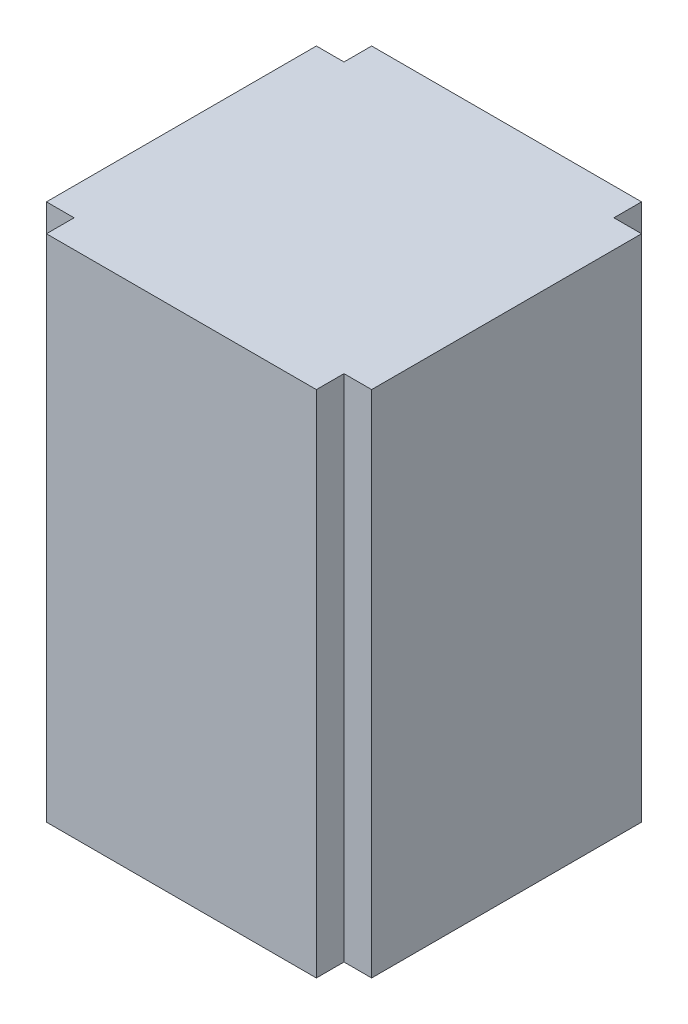
ISO-10303-21;
HEADER;
FILE_DESCRIPTION(('STEP AP214'),'2;1');
FILE_NAME('part.step','',(''),(''),'','','');
FILE_SCHEMA(('AUTOMOTIVE_DESIGN { 1 0 10303 214 1 1 1 1 }'));
ENDSEC;
DATA;
#1=APPLICATION_CONTEXT('core data for automotive mechanical design processes');
#2=APPLICATION_PROTOCOL_DEFINITION('international standard','automotive_design',2000,#1);
#3=PRODUCT_CONTEXT('',#1,'mechanical');
#4=PRODUCT('Part','Part','',(#3));
#5=PRODUCT_RELATED_PRODUCT_CATEGORY('part','',(#4));
#6=PRODUCT_DEFINITION_FORMATION('','',#4);
#7=PRODUCT_DEFINITION_CONTEXT('part definition',#1,'design');
#8=PRODUCT_DEFINITION('design','',#6,#7);
#9=PRODUCT_DEFINITION_SHAPE('','',#8);
#10=(LENGTH_UNIT() NAMED_UNIT(*) SI_UNIT(.MILLI.,.METRE.));
#11=(NAMED_UNIT(*) PLANE_ANGLE_UNIT() SI_UNIT($,.RADIAN.));
#12=(NAMED_UNIT(*) SI_UNIT($,.STERADIAN.) SOLID_ANGLE_UNIT());
#13=UNCERTAINTY_MEASURE_WITH_UNIT(LENGTH_MEASURE(1.E-05),#10,'distance_accuracy_value','');
#14=(GEOMETRIC_REPRESENTATION_CONTEXT(3) GLOBAL_UNCERTAINTY_ASSIGNED_CONTEXT((#13)) GLOBAL_UNIT_ASSIGNED_CONTEXT((#10,
#11,#12)) REPRESENTATION_CONTEXT('',''));
#15=CARTESIAN_POINT('',(0.,0.,0.));
#16=DIRECTION('',(0.,0.,1.));
#17=DIRECTION('',(1.,0.,0.));
#18=AXIS2_PLACEMENT_3D('',#15,#16,#17);
#19=CARTESIAN_POINT('',(-34.9151502031404,78.35,-45.0524541332438));
#20=DIRECTION('',(-1.,0.,0.));
#21=DIRECTION('',(0.,0.,1.));
#22=AXIS2_PLACEMENT_3D('',#19,#20,#21);
#23=PLANE('',#22);
#24=DIRECTION('',(0.,0.,-1.));
#25=VECTOR('',#24,1.);
#26=CARTESIAN_POINT('',(-34.9151502031404,-78.35,-45.0524541332438));
#27=LINE('',#26,#25);
#28=CARTESIAN_POINT('',(-34.9151502031404,-78.35,-45.0524541332438));
#29=VERTEX_POINT('',#28);
#30=CARTESIAN_POINT('',(-34.9151502031404,-78.35,-53.5524541332438));
#31=VERTEX_POINT('',#30);
#32=EDGE_CURVE('E154',#29,#31,#27,.T.);
#33=ORIENTED_EDGE('',*,*,#32,.F.);
#34=DIRECTION('',(0.,-1.,0.));
#35=VECTOR('',#34,1.);
#36=CARTESIAN_POINT('',(-34.9151502031404,78.35,-45.0524541332438));
#37=LINE('',#36,#35);
#38=CARTESIAN_POINT('',(-34.9151502031404,78.35,-45.0524541332438));
#39=VERTEX_POINT('',#38);
#40=EDGE_CURVE('E11',#39,#29,#37,.T.);
#41=ORIENTED_EDGE('',*,*,#40,.F.);
#42=DIRECTION('',(0.,0.,-1.));
#43=VECTOR('',#42,1.);
#44=CARTESIAN_POINT('',(-34.9151502031404,78.35,-45.0524541332438));
#45=LINE('',#44,#43);
#46=CARTESIAN_POINT('',(-34.9151502031404,78.35,-53.5524541332438));
#47=VERTEX_POINT('',#46);
#48=EDGE_CURVE('E184',#39,#47,#45,.T.);
#49=ORIENTED_EDGE('',*,*,#48,.T.);
#50=DIRECTION('',(0.,-1.,0.));
#51=VECTOR('',#50,1.);
#52=CARTESIAN_POINT('',(-34.9151502031404,78.35,-53.5524541332438));
#53=LINE('',#52,#51);
#54=EDGE_CURVE('E36',#47,#31,#53,.T.);
#55=ORIENTED_EDGE('',*,*,#54,.T.);
#56=EDGE_LOOP('',(#33,#41,#49,#55));
#57=FACE_BOUND('',#56,.T.);
#58=ADVANCED_FACE('F33',(#57),#23,.T.);
#59=CARTESIAN_POINT('',(-34.9151502031404,78.35,-45.0524541332438));
#60=DIRECTION('',(0.,0.,1.));
#61=DIRECTION('',(1.,0.,0.));
#62=AXIS2_PLACEMENT_3D('',#59,#60,#61);
#63=PLANE('',#62);
#64=DIRECTION('',(-1.,0.,0.));
#65=VECTOR('',#64,1.);
#66=CARTESIAN_POINT('',(-34.9151502031404,-78.35,-45.0524541332438));
#67=LINE('',#66,#65);
#68=CARTESIAN_POINT('',(-43.4151502031404,-78.35,-45.0524541332438));
#69=VERTEX_POINT('',#68);
#70=EDGE_CURVE('E183',#29,#69,#67,.T.);
#71=ORIENTED_EDGE('',*,*,#70,.T.);
#72=DIRECTION('',(0.,-1.,0.));
#73=VECTOR('',#72,1.);
#74=CARTESIAN_POINT('',(-43.4151502031404,78.35,-45.0524541332438));
#75=LINE('',#74,#73);
#76=CARTESIAN_POINT('',(-43.4151502031404,78.35,-45.0524541332438));
#77=VERTEX_POINT('',#76);
#78=EDGE_CURVE('E42',#77,#69,#75,.T.);
#79=ORIENTED_EDGE('',*,*,#78,.F.);
#80=DIRECTION('',(-1.,0.,0.));
#81=VECTOR('',#80,1.);
#82=CARTESIAN_POINT('',(-34.9151502031404,78.35,-45.0524541332438));
#83=LINE('',#82,#81);
#84=EDGE_CURVE('E143',#39,#77,#83,.T.);
#85=ORIENTED_EDGE('',*,*,#84,.F.);
#86=ORIENTED_EDGE('',*,*,#40,.T.);
#87=EDGE_LOOP('',(#71,#79,#85,#86));
#88=FACE_BOUND('',#87,.T.);
#89=ADVANCED_FACE('F206',(#88),#63,.F.);
#90=CARTESIAN_POINT('',(-43.4151502031404,78.35,37.9475458667562));
#91=DIRECTION('',(-1.,0.,0.));
#92=DIRECTION('',(0.,0.,1.));
#93=AXIS2_PLACEMENT_3D('',#90,#91,#92);
#94=PLANE('',#93);
#95=DIRECTION('',(0.,0.,-1.));
#96=VECTOR('',#95,1.);
#97=CARTESIAN_POINT('',(-43.4151502031404,-78.35,37.9475458667562));
#98=LINE('',#97,#96);
#99=CARTESIAN_POINT('',(-43.4151502031404,-78.35,37.9475458667562));
#100=VERTEX_POINT('',#99);
#101=EDGE_CURVE('E131',#100,#69,#98,.T.);
#102=ORIENTED_EDGE('',*,*,#101,.F.);
#103=DIRECTION('',(0.,-1.,0.));
#104=VECTOR('',#103,1.);
#105=CARTESIAN_POINT('',(-43.4151502031404,78.35,37.9475458667562));
#106=LINE('',#105,#104);
#107=CARTESIAN_POINT('',(-43.4151502031404,78.35,37.9475458667562));
#108=VERTEX_POINT('',#107);
#109=EDGE_CURVE('E126',#108,#100,#106,.T.);
#110=ORIENTED_EDGE('',*,*,#109,.F.);
#111=DIRECTION('',(0.,0.,-1.));
#112=VECTOR('',#111,1.);
#113=CARTESIAN_POINT('',(-43.4151502031404,78.35,37.9475458667562));
#114=LINE('',#113,#112);
#115=EDGE_CURVE('E129',#108,#77,#114,.T.);
#116=ORIENTED_EDGE('',*,*,#115,.T.);
#117=ORIENTED_EDGE('',*,*,#78,.T.);
#118=EDGE_LOOP('',(#102,#110,#116,#117));
#119=FACE_BOUND('',#118,.T.);
#120=ADVANCED_FACE('F128',(#119),#94,.T.);
#121=CARTESIAN_POINT('',(-34.9151502031404,78.35,37.9475458667562));
#122=DIRECTION('',(0.,0.,1.));
#123=DIRECTION('',(1.,0.,0.));
#124=AXIS2_PLACEMENT_3D('',#121,#122,#123);
#125=PLANE('',#124);
#126=DIRECTION('',(-1.,0.,0.));
#127=VECTOR('',#126,1.);
#128=CARTESIAN_POINT('',(-34.9151502031404,-78.35,37.9475458667562));
#129=LINE('',#128,#127);
#130=CARTESIAN_POINT('',(-34.9151502031404,-78.35,37.9475458667562));
#131=VERTEX_POINT('',#130);
#132=EDGE_CURVE('E180',#131,#100,#129,.T.);
#133=ORIENTED_EDGE('',*,*,#132,.F.);
#134=DIRECTION('',(0.,-1.,0.));
#135=VECTOR('',#134,1.);
#136=CARTESIAN_POINT('',(-34.9151502031404,78.35,37.9475458667562));
#137=LINE('',#136,#135);
#138=CARTESIAN_POINT('',(-34.9151502031404,78.35,37.9475458667562));
#139=VERTEX_POINT('',#138);
#140=EDGE_CURVE('E136',#139,#131,#137,.T.);
#141=ORIENTED_EDGE('',*,*,#140,.F.);
#142=DIRECTION('',(-1.,0.,0.));
#143=VECTOR('',#142,1.);
#144=CARTESIAN_POINT('',(-34.9151502031404,78.35,37.9475458667562));
#145=LINE('',#144,#143);
#146=EDGE_CURVE('E142',#139,#108,#145,.T.);
#147=ORIENTED_EDGE('',*,*,#146,.T.);
#148=ORIENTED_EDGE('',*,*,#109,.T.);
#149=EDGE_LOOP('',(#133,#141,#147,#148));
#150=FACE_BOUND('',#149,.T.);
#151=ADVANCED_FACE('F145',(#150),#125,.T.);
#152=CARTESIAN_POINT('',(-34.9151502031404,78.35,37.9475458667562));
#153=DIRECTION('',(1.,0.,0.));
#154=DIRECTION('',(0.,0.,-1.));
#155=AXIS2_PLACEMENT_3D('',#152,#153,#154);
#156=PLANE('',#155);
#157=DIRECTION('',(0.,0.,1.));
#158=VECTOR('',#157,1.);
#159=CARTESIAN_POINT('',(-34.9151502031404,-78.35,37.9475458667562));
#160=LINE('',#159,#158);
#161=CARTESIAN_POINT('',(-34.9151502031404,-78.35,46.4475458667562));
#162=VERTEX_POINT('',#161);
#163=EDGE_CURVE('E178',#131,#162,#160,.T.);
#164=ORIENTED_EDGE('',*,*,#163,.T.);
#165=DIRECTION('',(0.,-1.,0.));
#166=VECTOR('',#165,1.);
#167=CARTESIAN_POINT('',(-34.9151502031404,78.35,46.4475458667562));
#168=LINE('',#167,#166);
#169=CARTESIAN_POINT('',(-34.9151502031404,78.35,46.4475458667562));
#170=VERTEX_POINT('',#169);
#171=EDGE_CURVE('E188',#170,#162,#168,.T.);
#172=ORIENTED_EDGE('',*,*,#171,.F.);
#173=DIRECTION('',(0.,0.,1.));
#174=VECTOR('',#173,1.);
#175=CARTESIAN_POINT('',(-34.9151502031404,78.35,37.9475458667562));
#176=LINE('',#175,#174);
#177=EDGE_CURVE('E147',#139,#170,#176,.T.);
#178=ORIENTED_EDGE('',*,*,#177,.F.);
#179=ORIENTED_EDGE('',*,*,#140,.T.);
#180=EDGE_LOOP('',(#164,#172,#178,#179));
#181=FACE_BOUND('',#180,.T.);
#182=ADVANCED_FACE('F271',(#181),#156,.F.);
#183=CARTESIAN_POINT('',(-34.9151502031404,78.35,46.4475458667562));
#184=DIRECTION('',(0.,0.,-1.));
#185=DIRECTION('',(-1.,0.,0.));
#186=AXIS2_PLACEMENT_3D('',#183,#184,#185);
#187=PLANE('',#186);
#188=DIRECTION('',(1.,0.,0.));
#189=VECTOR('',#188,1.);
#190=CARTESIAN_POINT('',(-34.9151502031404,-78.35,46.4475458667562));
#191=LINE('',#190,#189);
#192=CARTESIAN_POINT('',(48.0848497968596,-78.35,46.4475458667562));
#193=VERTEX_POINT('',#192);
#194=EDGE_CURVE('E175',#162,#193,#191,.T.);
#195=ORIENTED_EDGE('',*,*,#194,.T.);
#196=DIRECTION('',(0.,-1.,0.));
#197=VECTOR('',#196,1.);
#198=CARTESIAN_POINT('',(48.0848497968596,78.35,46.4475458667562));
#199=LINE('',#198,#197);
#200=CARTESIAN_POINT('',(48.0848497968596,78.35,46.4475458667562));
#201=VERTEX_POINT('',#200);
#202=EDGE_CURVE('E191',#201,#193,#199,.T.);
#203=ORIENTED_EDGE('',*,*,#202,.F.);
#204=DIRECTION('',(1.,0.,0.));
#205=VECTOR('',#204,1.);
#206=CARTESIAN_POINT('',(-34.9151502031404,78.35,46.4475458667562));
#207=LINE('',#206,#205);
#208=EDGE_CURVE('E149',#170,#201,#207,.T.);
#209=ORIENTED_EDGE('',*,*,#208,.F.);
#210=ORIENTED_EDGE('',*,*,#171,.T.);
#211=EDGE_LOOP('',(#195,#203,#209,#210));
#212=FACE_BOUND('',#211,.T.);
#213=ADVANCED_FACE('F228',(#212),#187,.F.);
#214=CARTESIAN_POINT('',(48.0848497968596,78.35,37.9475458667562));
#215=DIRECTION('',(1.,0.,0.));
#216=DIRECTION('',(0.,0.,-1.));
#217=AXIS2_PLACEMENT_3D('',#214,#215,#216);
#218=PLANE('',#217);
#219=DIRECTION('',(0.,0.,1.));
#220=VECTOR('',#219,1.);
#221=CARTESIAN_POINT('',(48.0848497968596,-78.35,37.9475458667562));
#222=LINE('',#221,#220);
#223=CARTESIAN_POINT('',(48.0848497968596,-78.35,37.9475458667562));
#224=VERTEX_POINT('',#223);
#225=EDGE_CURVE('E172',#224,#193,#222,.T.);
#226=ORIENTED_EDGE('',*,*,#225,.F.);
#227=DIRECTION('',(0.,-1.,0.));
#228=VECTOR('',#227,1.);
#229=CARTESIAN_POINT('',(48.0848497968596,78.35,37.9475458667562));
#230=LINE('',#229,#228);
#231=CARTESIAN_POINT('',(48.0848497968596,78.35,37.9475458667562));
#232=VERTEX_POINT('',#231);
#233=EDGE_CURVE('E193',#232,#224,#230,.T.);
#234=ORIENTED_EDGE('',*,*,#233,.F.);
#235=DIRECTION('',(0.,0.,1.));
#236=VECTOR('',#235,1.);
#237=CARTESIAN_POINT('',(48.0848497968596,78.35,37.9475458667562));
#238=LINE('',#237,#236);
#239=EDGE_CURVE('E221',#232,#201,#238,.T.);
#240=ORIENTED_EDGE('',*,*,#239,.T.);
#241=ORIENTED_EDGE('',*,*,#202,.T.);
#242=EDGE_LOOP('',(#226,#234,#240,#241));
#243=FACE_BOUND('',#242,.T.);
#244=ADVANCED_FACE('F232',(#243),#218,.T.);
#245=CARTESIAN_POINT('',(48.0848497968596,78.35,37.9475458667562));
#246=DIRECTION('',(0.,0.,-1.));
#247=DIRECTION('',(-1.,0.,0.));
#248=AXIS2_PLACEMENT_3D('',#245,#246,#247);
#249=PLANE('',#248);
#250=DIRECTION('',(1.,0.,0.));
#251=VECTOR('',#250,1.);
#252=CARTESIAN_POINT('',(48.0848497968596,-78.35,37.9475458667562));
#253=LINE('',#252,#251);
#254=CARTESIAN_POINT('',(56.5848497968596,-78.35,37.9475458667562));
#255=VERTEX_POINT('',#254);
#256=EDGE_CURVE('E169',#224,#255,#253,.T.);
#257=ORIENTED_EDGE('',*,*,#256,.T.);
#258=DIRECTION('',(0.,-1.,0.));
#259=VECTOR('',#258,1.);
#260=CARTESIAN_POINT('',(56.5848497968596,78.35,37.9475458667562));
#261=LINE('',#260,#259);
#262=CARTESIAN_POINT('',(56.5848497968596,78.35,37.9475458667562));
#263=VERTEX_POINT('',#262);
#264=EDGE_CURVE('E195',#263,#255,#261,.T.);
#265=ORIENTED_EDGE('',*,*,#264,.F.);
#266=DIRECTION('',(1.,0.,0.));
#267=VECTOR('',#266,1.);
#268=CARTESIAN_POINT('',(48.0848497968596,78.35,37.9475458667562));
#269=LINE('',#268,#267);
#270=EDGE_CURVE('E219',#232,#263,#269,.T.);
#271=ORIENTED_EDGE('',*,*,#270,.F.);
#272=ORIENTED_EDGE('',*,*,#233,.T.);
#273=EDGE_LOOP('',(#257,#265,#271,#272));
#274=FACE_BOUND('',#273,.T.);
#275=ADVANCED_FACE('F237',(#274),#249,.F.);
#276=CARTESIAN_POINT('',(56.5848497968596,78.35,-45.0524541332438));
#277=DIRECTION('',(1.,0.,0.));
#278=DIRECTION('',(0.,0.,-1.));
#279=AXIS2_PLACEMENT_3D('',#276,#277,#278);
#280=PLANE('',#279);
#281=DIRECTION('',(0.,0.,1.));
#282=VECTOR('',#281,1.);
#283=CARTESIAN_POINT('',(56.5848497968596,-78.35,-45.0524541332438));
#284=LINE('',#283,#282);
#285=CARTESIAN_POINT('',(56.5848497968596,-78.35,-45.0524541332438));
#286=VERTEX_POINT('',#285);
#287=EDGE_CURVE('E166',#286,#255,#284,.T.);
#288=ORIENTED_EDGE('',*,*,#287,.F.);
#289=DIRECTION('',(0.,-1.,0.));
#290=VECTOR('',#289,1.);
#291=CARTESIAN_POINT('',(56.5848497968596,78.35,-45.0524541332438));
#292=LINE('',#291,#290);
#293=CARTESIAN_POINT('',(56.5848497968596,78.35,-45.0524541332438));
#294=VERTEX_POINT('',#293);
#295=EDGE_CURVE('E197',#294,#286,#292,.T.);
#296=ORIENTED_EDGE('',*,*,#295,.F.);
#297=DIRECTION('',(0.,0.,1.));
#298=VECTOR('',#297,1.);
#299=CARTESIAN_POINT('',(56.5848497968596,78.35,-45.0524541332438));
#300=LINE('',#299,#298);
#301=EDGE_CURVE('E216',#294,#263,#300,.T.);
#302=ORIENTED_EDGE('',*,*,#301,.T.);
#303=ORIENTED_EDGE('',*,*,#264,.T.);
#304=EDGE_LOOP('',(#288,#296,#302,#303));
#305=FACE_BOUND('',#304,.T.);
#306=ADVANCED_FACE('F248',(#305),#280,.T.);
#307=CARTESIAN_POINT('',(48.0848497968596,78.35,-45.0524541332438));
#308=DIRECTION('',(0.,0.,-1.));
#309=DIRECTION('',(-1.,0.,0.));
#310=AXIS2_PLACEMENT_3D('',#307,#308,#309);
#311=PLANE('',#310);
#312=DIRECTION('',(1.,0.,0.));
#313=VECTOR('',#312,1.);
#314=CARTESIAN_POINT('',(48.0848497968596,-78.35,-45.0524541332438));
#315=LINE('',#314,#313);
#316=CARTESIAN_POINT('',(48.0848497968596,-78.35,-45.0524541332438));
#317=VERTEX_POINT('',#316);
#318=EDGE_CURVE('E163',#317,#286,#315,.T.);
#319=ORIENTED_EDGE('',*,*,#318,.F.);
#320=DIRECTION('',(0.,-1.,0.));
#321=VECTOR('',#320,1.);
#322=CARTESIAN_POINT('',(48.0848497968596,78.35,-45.0524541332438));
#323=LINE('',#322,#321);
#324=CARTESIAN_POINT('',(48.0848497968596,78.35,-45.0524541332438));
#325=VERTEX_POINT('',#324);
#326=EDGE_CURVE('E199',#325,#317,#323,.T.);
#327=ORIENTED_EDGE('',*,*,#326,.F.);
#328=DIRECTION('',(1.,0.,0.));
#329=VECTOR('',#328,1.);
#330=CARTESIAN_POINT('',(48.0848497968596,78.35,-45.0524541332438));
#331=LINE('',#330,#329);
#332=EDGE_CURVE('E213',#325,#294,#331,.T.);
#333=ORIENTED_EDGE('',*,*,#332,.T.);
#334=ORIENTED_EDGE('',*,*,#295,.T.);
#335=EDGE_LOOP('',(#319,#327,#333,#334));
#336=FACE_BOUND('',#335,.T.);
#337=ADVANCED_FACE('F243',(#336),#311,.T.);
#338=CARTESIAN_POINT('',(48.0848497968596,78.35,-45.0524541332438));
#339=DIRECTION('',(-1.,0.,0.));
#340=DIRECTION('',(0.,0.,1.));
#341=AXIS2_PLACEMENT_3D('',#338,#339,#340);
#342=PLANE('',#341);
#343=DIRECTION('',(0.,0.,-1.));
#344=VECTOR('',#343,1.);
#345=CARTESIAN_POINT('',(48.0848497968596,-78.35,-45.0524541332438));
#346=LINE('',#345,#344);
#347=CARTESIAN_POINT('',(48.0848497968596,-78.35,-53.5524541332438));
#348=VERTEX_POINT('',#347);
#349=EDGE_CURVE('E160',#317,#348,#346,.T.);
#350=ORIENTED_EDGE('',*,*,#349,.T.);
#351=DIRECTION('',(0.,-1.,0.));
#352=VECTOR('',#351,1.);
#353=CARTESIAN_POINT('',(48.0848497968596,78.35,-53.5524541332438));
#354=LINE('',#353,#352);
#355=CARTESIAN_POINT('',(48.0848497968596,78.35,-53.5524541332438));
#356=VERTEX_POINT('',#355);
#357=EDGE_CURVE('E200',#356,#348,#354,.T.);
#358=ORIENTED_EDGE('',*,*,#357,.F.);
#359=DIRECTION('',(0.,0.,-1.));
#360=VECTOR('',#359,1.);
#361=CARTESIAN_POINT('',(48.0848497968596,78.35,-45.0524541332438));
#362=LINE('',#361,#360);
#363=EDGE_CURVE('E209',#325,#356,#362,.T.);
#364=ORIENTED_EDGE('',*,*,#363,.F.);
#365=ORIENTED_EDGE('',*,*,#326,.T.);
#366=EDGE_LOOP('',(#350,#358,#364,#365));
#367=FACE_BOUND('',#366,.T.);
#368=ADVANCED_FACE('F247',(#367),#342,.F.);
#369=CARTESIAN_POINT('',(-34.9151502031404,78.35,-53.5524541332438));
#370=DIRECTION('',(0.,0.,-1.));
#371=DIRECTION('',(-1.,0.,0.));
#372=AXIS2_PLACEMENT_3D('',#369,#370,#371);
#373=PLANE('',#372);
#374=DIRECTION('',(1.,0.,0.));
#375=VECTOR('',#374,1.);
#376=CARTESIAN_POINT('',(-34.9151502031404,-78.35,-53.5524541332438));
#377=LINE('',#376,#375);
#378=EDGE_CURVE('E157',#31,#348,#377,.T.);
#379=ORIENTED_EDGE('',*,*,#378,.F.);
#380=ORIENTED_EDGE('',*,*,#54,.F.);
#381=DIRECTION('',(1.,0.,0.));
#382=VECTOR('',#381,1.);
#383=CARTESIAN_POINT('',(-34.9151502031404,78.35,-53.5524541332438));
#384=LINE('',#383,#382);
#385=EDGE_CURVE('E207',#47,#356,#384,.T.);
#386=ORIENTED_EDGE('',*,*,#385,.T.);
#387=ORIENTED_EDGE('',*,*,#357,.T.);
#388=EDGE_LOOP('',(#379,#380,#386,#387));
#389=FACE_BOUND('',#388,.T.);
#390=ADVANCED_FACE('F202',(#389),#373,.T.);
#391=CARTESIAN_POINT('',(0.,78.35,0.));
#392=DIRECTION('',(0.,-1.,0.));
#393=DIRECTION('',(0.,0.,-1.));
#394=AXIS2_PLACEMENT_3D('',#391,#392,#393);
#395=PLANE('',#394);
#396=ORIENTED_EDGE('',*,*,#48,.F.);
#397=ORIENTED_EDGE('',*,*,#84,.T.);
#398=ORIENTED_EDGE('',*,*,#115,.F.);
#399=ORIENTED_EDGE('',*,*,#146,.F.);
#400=ORIENTED_EDGE('',*,*,#177,.T.);
#401=ORIENTED_EDGE('',*,*,#208,.T.);
#402=ORIENTED_EDGE('',*,*,#239,.F.);
#403=ORIENTED_EDGE('',*,*,#270,.T.);
#404=ORIENTED_EDGE('',*,*,#301,.F.);
#405=ORIENTED_EDGE('',*,*,#332,.F.);
#406=ORIENTED_EDGE('',*,*,#363,.T.);
#407=ORIENTED_EDGE('',*,*,#385,.F.);
#408=EDGE_LOOP('',(#396,#397,#398,#399,#400,#401,#402,#403,#404,#405,#406,#407));
#409=FACE_BOUND('',#408,.T.);
#410=ADVANCED_FACE('F141',(#409),#395,.F.);
#411=CARTESIAN_POINT('',(0.,-78.35,0.));
#412=DIRECTION('',(0.,-1.,0.));
#413=DIRECTION('',(0.,0.,-1.));
#414=AXIS2_PLACEMENT_3D('',#411,#412,#413);
#415=PLANE('',#414);
#416=ORIENTED_EDGE('',*,*,#32,.T.);
#417=ORIENTED_EDGE('',*,*,#378,.T.);
#418=ORIENTED_EDGE('',*,*,#349,.F.);
#419=ORIENTED_EDGE('',*,*,#318,.T.);
#420=ORIENTED_EDGE('',*,*,#287,.T.);
#421=ORIENTED_EDGE('',*,*,#256,.F.);
#422=ORIENTED_EDGE('',*,*,#225,.T.);
#423=ORIENTED_EDGE('',*,*,#194,.F.);
#424=ORIENTED_EDGE('',*,*,#163,.F.);
#425=ORIENTED_EDGE('',*,*,#132,.T.);
#426=ORIENTED_EDGE('',*,*,#101,.T.);
#427=ORIENTED_EDGE('',*,*,#70,.F.);
#428=EDGE_LOOP('',(#416,#417,#418,#419,#420,#421,#422,#423,#424,#425,#426,#427));
#429=FACE_BOUND('',#428,.T.);
#430=ADVANCED_FACE('F205',(#429),#415,.T.);
#431=CLOSED_SHELL('',(#58,#89,#120,#151,#182,#213,#244,#275,#306,#337,#368,#390,#410,#430));
#432=MANIFOLD_SOLID_BREP('B2',#431);
#433=ADVANCED_BREP_SHAPE_REPRESENTATION('',(#18,#432),#14);
#434=SHAPE_DEFINITION_REPRESENTATION(#9,#433);
ENDSEC;
END-ISO-10303-21;
